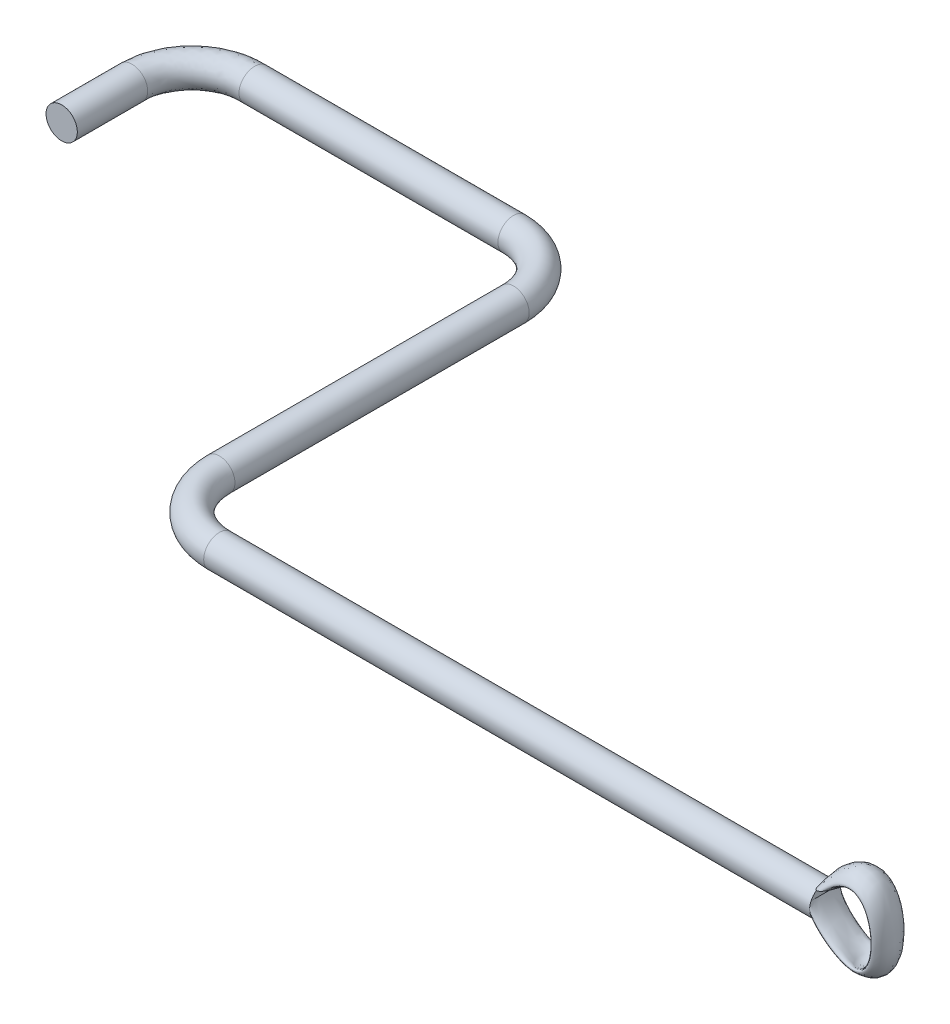
ISO-10303-21;
HEADER;
FILE_DESCRIPTION(('STEP AP214'),'2;1');
FILE_NAME('part.step','',(''),(''),'','','');
FILE_SCHEMA(('AUTOMOTIVE_DESIGN { 1 0 10303 214 1 1 1 1 }'));
ENDSEC;
DATA;
#1=APPLICATION_CONTEXT('core data for automotive mechanical design processes');
#2=APPLICATION_PROTOCOL_DEFINITION('international standard','automotive_design',2000,#1);
#3=PRODUCT_CONTEXT('',#1,'mechanical');
#4=PRODUCT('Part','Part','',(#3));
#5=PRODUCT_RELATED_PRODUCT_CATEGORY('part','',(#4));
#6=PRODUCT_DEFINITION_FORMATION('','',#4);
#7=PRODUCT_DEFINITION_CONTEXT('part definition',#1,'design');
#8=PRODUCT_DEFINITION('design','',#6,#7);
#9=PRODUCT_DEFINITION_SHAPE('','',#8);
#10=(LENGTH_UNIT() NAMED_UNIT(*) SI_UNIT(.MILLI.,.METRE.));
#11=(NAMED_UNIT(*) PLANE_ANGLE_UNIT() SI_UNIT($,.RADIAN.));
#12=(NAMED_UNIT(*) SI_UNIT($,.STERADIAN.) SOLID_ANGLE_UNIT());
#13=UNCERTAINTY_MEASURE_WITH_UNIT(LENGTH_MEASURE(1.E-05),#10,'distance_accuracy_value','');
#14=(GEOMETRIC_REPRESENTATION_CONTEXT(3) GLOBAL_UNCERTAINTY_ASSIGNED_CONTEXT((#13)) GLOBAL_UNIT_ASSIGNED_CONTEXT((#10,
#11,#12)) REPRESENTATION_CONTEXT('',''));
#15=CARTESIAN_POINT('',(0.,0.,0.));
#16=DIRECTION('',(0.,0.,1.));
#17=DIRECTION('',(1.,0.,0.));
#18=AXIS2_PLACEMENT_3D('',#15,#16,#17);
#19=CARTESIAN_POINT('',(-28.0867327548862,0.,-14.8763253538533));
#20=DIRECTION('',(1.,0.,0.));
#21=DIRECTION('',(0.,0.,-1.));
#22=AXIS2_PLACEMENT_3D('',#19,#20,#21);
#23=PLANE('',#22);
#24=CARTESIAN_POINT('',(-28.0867327548862,0.,-14.8763253538533));
#25=DIRECTION('',(1.,0.,0.));
#26=DIRECTION('',(0.,0.,-1.));
#27=AXIS2_PLACEMENT_3D('',#24,#25,#26);
#28=CIRCLE('',#27,1.5);
#29=CARTESIAN_POINT('',(-28.0867327548862,0.66725188973408,-16.2138998346889));
#30=VERTEX_POINT('',#29);
#31=CARTESIAN_POINT('',(-28.0867327548862,0.667190066581111,-13.5390715850401));
#32=VERTEX_POINT('',#31);
#33=EDGE_CURVE('E50',#30,#32,#28,.T.);
#34=ORIENTED_EDGE('',*,*,#33,.T.);
#35=CARTESIAN_POINT('',(-28.0867327548862,0.662897590662795,-16.204779537628));
#36=CARTESIAN_POINT('',(-28.0867327548859,0.662373655609823,-16.2024232680016));
#37=CARTESIAN_POINT('',(-28.0867327548858,0.661861788854896,-16.2000643351667));
#38=CARTESIAN_POINT('',(-28.0867327548846,0.657691507317004,-16.1803806935537));
#39=CARTESIAN_POINT('',(-28.0867327548857,0.654643909870637,-16.162925273578));
#40=CARTESIAN_POINT('',(-28.0867327548866,0.649395506396306,-16.1278857030632));
#41=CARTESIAN_POINT('',(-28.0867327548863,0.647195226447549,-16.1103014794339));
#42=CARTESIAN_POINT('',(-28.0867327548859,0.641471875485622,-16.057370233921));
#43=CARTESIAN_POINT('',(-28.0867327548861,0.638841175113105,-16.0219289173038));
#44=CARTESIAN_POINT('',(-28.0867327548862,0.634837098240325,-15.9509355237771));
#45=CARTESIAN_POINT('',(-28.0867327548862,0.633465703658227,-15.9153833603338));
#46=CARTESIAN_POINT('',(-28.0867327548861,0.63144874348452,-15.8440249735028));
#47=CARTESIAN_POINT('',(-28.0867327548861,0.630808010348437,-15.8082186168554));
#48=CARTESIAN_POINT('',(-28.0867327548862,0.629953066052022,-15.7366719912004));
#49=CARTESIAN_POINT('',(-28.0867327548864,0.629738027587962,-15.7009317291334));
#50=CARTESIAN_POINT('',(-28.086732754886,0.629549553101969,-15.629475085263));
#51=CARTESIAN_POINT('',(-28.0867327548854,0.629575952454032,-15.5937587037921));
#52=CARTESIAN_POINT('',(-28.0867327548847,0.629843538213155,-15.4817211714316));
#53=CARTESIAN_POINT('',(-28.0867327548858,0.630294791709847,-15.4054008289412));
#54=CARTESIAN_POINT('',(-28.0867327548865,0.631151077054613,-15.2527070467432));
#55=CARTESIAN_POINT('',(-28.0867327548863,0.631556076601742,-15.1763336069512));
#56=CARTESIAN_POINT('',(-28.0867327548861,0.632109942559785,-15.0235602445307));
#57=CARTESIAN_POINT('',(-28.0867327548861,0.632258723904588,-14.9471603215267));
#58=CARTESIAN_POINT('',(-28.0867327548862,0.632243962390603,-14.7943600328904));
#59=CARTESIAN_POINT('',(-28.0867327548862,0.632080417596263,-14.7179596672583));
#60=CARTESIAN_POINT('',(-28.0867327548862,0.631503143840482,-14.565185470391));
#61=CARTESIAN_POINT('',(-28.0867327548862,0.631089497968975,-14.4888116387685));
#62=CARTESIAN_POINT('',(-28.0867327548861,0.630232447118724,-14.3361163213644));
#63=CARTESIAN_POINT('',(-28.0867327548861,0.629789062744159,-14.2597948356058));
#64=CARTESIAN_POINT('',(-28.0867327548861,0.629566031434188,-14.1483765494744));
#65=CARTESIAN_POINT('',(-28.0867327548861,0.629557226749275,-14.1132805474324));
#66=CARTESIAN_POINT('',(-28.0867327548862,0.629785203470881,-14.0430655513341));
#67=CARTESIAN_POINT('',(-28.0867327548862,0.630022150230032,-14.0079465577071));
#68=CARTESIAN_POINT('',(-28.0867327548862,0.630922603191843,-13.9376451814509));
#69=CARTESIAN_POINT('',(-28.0867327548861,0.631586926494628,-13.9024628064063));
#70=CARTESIAN_POINT('',(-28.0867327548862,0.63364665295898,-13.8323475017529));
#71=CARTESIAN_POINT('',(-28.0867327548862,0.635037282424472,-13.7974144354105));
#72=CARTESIAN_POINT('',(-28.0867327548861,0.639062152017563,-13.7276583152487));
#73=CARTESIAN_POINT('',(-28.0867327548861,0.641694472218967,-13.6928351748546));
#74=CARTESIAN_POINT('',(-28.0867327548862,0.647381782338597,-13.6408280894011));
#75=CARTESIAN_POINT('',(-28.0867327548863,0.649563742869341,-13.6235506907368));
#76=CARTESIAN_POINT('',(-28.086732754886,0.654749007987336,-13.5891213997286));
#77=CARTESIAN_POINT('',(-28.0867327548856,0.657751813381786,-13.5719694375895));
#78=CARTESIAN_POINT('',(-28.0867327548862,0.661862316375775,-13.552586092982));
#79=CARTESIAN_POINT('',(-28.0867327548863,0.662374743896722,-13.5502272846936));
#80=CARTESIAN_POINT('',(-28.0867327548864,0.662899374402507,-13.547871170076));
#81=B_SPLINE_CURVE_WITH_KNOTS('',3,(#35,#36,#37,#38,#39,#40,#41,#42,#43,#44,#45,#46,#47,#48,#49,
#50,#51,#52,#53,#54,#55,#56,#57,#58,#59,#60,#61,#62,#63,#64,#65,#66,#67,#68,#69,#70,#71,#72,#73,
#74,#75,#76,#77,#78,#79,#80),.UNSPECIFIED.,.F.,.F.,(4,2,2,2,2,2,2,2,2,2,2,2,2,2,2,2,2,2,2,2,2,2,
4),(0.,0.00724141043704764,0.0603611622285066,0.113513841835515,0.220075324803818,
0.326804230149168,0.434234999095671,0.541456779119819,0.648605454703506,0.877570038730344,
1.10669355243074,1.33589312197412,1.56509411192115,1.7942189972832,2.02318674248067,
2.12847422168256,2.23383258902594,2.33939299183055,2.44426816399734,2.54898170504612,
2.60121471090506,2.65341602191442,2.66065742354629),.UNSPECIFIED.);
#82=EDGE_CURVE('E86',#30,#32,#81,.T.);
#83=ORIENTED_EDGE('',*,*,#82,.F.);
#84=EDGE_LOOP('',(#34,#83));
#85=FACE_BOUND('',#84,.T.);
#86=ADVANCED_FACE('F33',(#85),#23,.T.);
#87=CARTESIAN_POINT('',(-129.28449648949,0.,-42.8339767538688));
#88=DIRECTION('',(0.,0.,-1.));
#89=DIRECTION('',(-1.,0.,0.));
#90=AXIS2_PLACEMENT_3D('',#87,#88,#89);
#91=PLANE('',#90);
#92=CARTESIAN_POINT('',(-129.28449648949,0.,-42.8339767538688));
#93=DIRECTION('',(0.,0.,-1.));
#94=DIRECTION('',(-1.,0.,0.));
#95=AXIS2_PLACEMENT_3D('',#92,#93,#94);
#96=CIRCLE('',#95,1.5);
#97=CARTESIAN_POINT('',(-130.78449648949,0.,-42.8339767538688));
#98=VERTEX_POINT('',#97);
#99=EDGE_CURVE('E126',#98,#98,#96,.T.);
#100=ORIENTED_EDGE('',*,*,#99,.F.);
#101=EDGE_LOOP('',(#100));
#102=FACE_BOUND('',#101,.T.);
#103=ADVANCED_FACE('F199',(#102),#91,.F.);
#104=CARTESIAN_POINT('',(-98.4278171552191,0.,-49.4561485789191));
#105=DIRECTION('',(0.,-1.,0.));
#106=DIRECTION('',(0.,0.,-1.));
#107=AXIS2_PLACEMENT_3D('',#104,#105,#106);
#108=TOROIDAL_SURFACE('',#107,5.8636289646401,1.5);
#109=CARTESIAN_POINT('',(-98.4278171552191,0.,-55.3197775435592));
#110=DIRECTION('',(1.,0.,0.));
#111=DIRECTION('',(0.,0.,-1.));
#112=AXIS2_PLACEMENT_3D('',#109,#110,#111);
#113=CIRCLE('',#112,1.5);
#114=CARTESIAN_POINT('',(-98.4278171552191,0.,-56.8197775435592));
#115=VERTEX_POINT('',#114);
#116=EDGE_CURVE('E290',#115,#115,#113,.T.);
#117=CARTESIAN_POINT('',(-92.564188190579,0.,-49.4561485789191));
#118=DIRECTION('',(0.,0.,1.));
#119=DIRECTION('',(1.,0.,0.));
#120=AXIS2_PLACEMENT_3D('',#117,#118,#119);
#121=CIRCLE('',#120,1.5);
#122=CARTESIAN_POINT('',(-91.064188190579,0.,-49.4561485789191));
#123=VERTEX_POINT('',#122);
#124=EDGE_CURVE('E289',#123,#123,#121,.T.);
#125=CARTESIAN_POINT('',(-98.4278171552191,0.,-49.4561485789191));
#126=DIRECTION('',(0.,-1.,0.));
#127=DIRECTION('',(0.,0.,-1.));
#128=AXIS2_PLACEMENT_3D('',#125,#126,#127);
#129=CIRCLE('',#128,7.3636289646401);
#130=EDGE_CURVE('',#115,#123,#129,.T.);
#131=ORIENTED_EDGE('',*,*,#116,.T.);
#132=ORIENTED_EDGE('',*,*,#124,.F.);
#133=ORIENTED_EDGE('',*,*,#130,.T.);
#134=ORIENTED_EDGE('',*,*,#130,.F.);
#135=EDGE_LOOP('',(#131,#133,#132,#134));
#136=FACE_BOUND('',#135,.T.);
#137=ADVANCED_FACE('F163',(#136),#108,.T.);
#138=CARTESIAN_POINT('',(-92.564188190579,0.,-49.4561485789191));
#139=DIRECTION('',(0.,0.,1.));
#140=DIRECTION('',(1.,0.,0.));
#141=AXIS2_PLACEMENT_3D('',#138,#139,#140);
#142=CYLINDRICAL_SURFACE('',#141,1.5);
#143=CARTESIAN_POINT('',(-92.564188190579,0.,-21.2352715982895));
#144=DIRECTION('',(0.,0.,1.));
#145=DIRECTION('',(1.,0.,0.));
#146=AXIS2_PLACEMENT_3D('',#143,#144,#145);
#147=CIRCLE('',#146,1.5);
#148=CARTESIAN_POINT('',(-94.064188190579,0.,-21.2352715982895));
#149=VERTEX_POINT('',#148);
#150=EDGE_CURVE('E286',#149,#149,#147,.T.);
#151=ORIENTED_EDGE('',*,*,#150,.F.);
#152=EDGE_LOOP('',(#151));
#153=FACE_BOUND('',#152,.T.);
#154=ORIENTED_EDGE('',*,*,#124,.T.);
#155=EDGE_LOOP('',(#154));
#156=FACE_BOUND('',#155,.T.);
#157=ADVANCED_FACE('F207',(#153,#156),#142,.T.);
#158=CARTESIAN_POINT('',(-86.2052419461428,0.,-21.2352715982895));
#159=DIRECTION('',(0.,1.,0.));
#160=DIRECTION('',(0.,0.,1.));
#161=AXIS2_PLACEMENT_3D('',#158,#159,#160);
#162=TOROIDAL_SURFACE('',#161,6.35894624443623,1.5);
#163=CARTESIAN_POINT('',(-86.2052419461428,0.,-14.8763253538533));
#164=DIRECTION('',(1.,0.,0.));
#165=DIRECTION('',(0.,0.,-1.));
#166=AXIS2_PLACEMENT_3D('',#163,#164,#165);
#167=CIRCLE('',#166,1.5);
#168=CARTESIAN_POINT('',(-86.2052419461428,0.,-13.3763253538533));
#169=VERTEX_POINT('',#168);
#170=EDGE_CURVE('E178',#169,#169,#167,.T.);
#171=CARTESIAN_POINT('',(-86.2052419461428,0.,-21.2352715982895));
#172=DIRECTION('',(0.,1.,0.));
#173=DIRECTION('',(0.,0.,1.));
#174=AXIS2_PLACEMENT_3D('',#171,#172,#173);
#175=CIRCLE('',#174,7.85894624443622);
#176=EDGE_CURVE('',#149,#169,#175,.T.);
#177=ORIENTED_EDGE('',*,*,#150,.T.);
#178=ORIENTED_EDGE('',*,*,#170,.F.);
#179=ORIENTED_EDGE('',*,*,#176,.T.);
#180=ORIENTED_EDGE('',*,*,#176,.F.);
#181=EDGE_LOOP('',(#177,#179,#178,#180));
#182=FACE_BOUND('',#181,.T.);
#183=ADVANCED_FACE('F198',(#182),#162,.T.);
#184=CARTESIAN_POINT('',(-86.2052419461428,0.,-14.8763253538533));
#185=DIRECTION('',(1.,0.,0.));
#186=DIRECTION('',(0.,0.,-1.));
#187=AXIS2_PLACEMENT_3D('',#184,#185,#186);
#188=CYLINDRICAL_SURFACE('',#187,1.5);
#189=CARTESIAN_POINT('',(-28.0867327548862,0.,-16.3763253538533));
#190=VERTEX_POINT('',#189);
#191=EDGE_CURVE('E56',#190,#30,#28,.T.);
#192=ORIENTED_EDGE('',*,*,#191,.F.);
#193=EDGE_CURVE('E37',#32,#190,#28,.T.);
#194=ORIENTED_EDGE('',*,*,#193,.F.);
#195=ORIENTED_EDGE('',*,*,#33,.F.);
#196=EDGE_LOOP('',(#192,#194,#195));
#197=FACE_BOUND('',#196,.T.);
#198=ORIENTED_EDGE('',*,*,#170,.T.);
#199=EDGE_LOOP('',(#198));
#200=FACE_BOUND('',#199,.T.);
#201=ADVANCED_FACE('F161',(#197,#200),#188,.T.);
#202=CARTESIAN_POINT('',(-123.627817155219,0.,-55.3197775435592));
#203=DIRECTION('',(1.,0.,0.));
#204=DIRECTION('',(0.,0.,-1.));
#205=AXIS2_PLACEMENT_3D('',#202,#203,#204);
#206=CYLINDRICAL_SURFACE('',#205,1.5);
#207=ORIENTED_EDGE('',*,*,#116,.F.);
#208=EDGE_LOOP('',(#207));
#209=FACE_BOUND('',#208,.T.);
#210=CARTESIAN_POINT('',(-123.227859144867,0.,-55.3156794835219));
#211=DIRECTION('',(0.99979005176,0.,0.0204903001865974));
#212=DIRECTION('',(0.0204903001865974,0.,-0.99979005176));
#213=AXIS2_PLACEMENT_3D('',#210,#211,#212);
#214=CIRCLE('',#213,1.5);
#215=CARTESIAN_POINT('',(-123.197123694587,0.,-56.8175710523606));
#216=VERTEX_POINT('',#215);
#217=EDGE_CURVE('E11',#216,#216,#214,.T.);
#218=ORIENTED_EDGE('',*,*,#217,.T.);
#219=EDGE_LOOP('',(#218));
#220=FACE_BOUND('',#219,.T.);
#221=ADVANCED_FACE('F152',(#209,#220),#206,.T.);
#222=CARTESIAN_POINT('',(-129.28449648949,0.,-42.8339767538688));
#223=DIRECTION('',(0.,0.,-1.));
#224=DIRECTION('',(-1.,0.,0.));
#225=AXIS2_PLACEMENT_3D('',#222,#223,#224);
#226=CYLINDRICAL_SURFACE('',#225,1.5);
#227=CARTESIAN_POINT('',(-129.28449648949,0.,-49.5818986693735));
#228=DIRECTION('',(0.,0.,-1.));
#229=DIRECTION('',(-1.,0.,0.));
#230=AXIS2_PLACEMENT_3D('',#227,#228,#229);
#231=CIRCLE('',#230,1.5);
#232=CARTESIAN_POINT('',(-130.78449648949,0.,-49.5818986693735));
#233=VERTEX_POINT('',#232);
#234=EDGE_CURVE('E43',#233,#233,#231,.T.);
#235=ORIENTED_EDGE('',*,*,#234,.F.);
#236=EDGE_LOOP('',(#235));
#237=FACE_BOUND('',#236,.T.);
#238=ORIENTED_EDGE('',*,*,#99,.T.);
#239=EDGE_LOOP('',(#238));
#240=FACE_BOUND('',#239,.T.);
#241=ADVANCED_FACE('F151',(#237,#240),#226,.T.);
#242=CARTESIAN_POINT('',(-130.78449648949,0.,-49.5818986693735));
#243=CARTESIAN_POINT('',(-130.78449648949,0.,-49.6894611855601));
#244=CARTESIAN_POINT('',(-130.781512856763,0.,-49.8218397771141));
#245=CARTESIAN_POINT('',(-130.769593843221,0.,-50.0614026047151));
#246=CARTESIAN_POINT('',(-130.760658308925,0.,-50.1810187186135));
#247=CARTESIAN_POINT('',(-130.724954956472,0.,-50.5389915467595));
#248=CARTESIAN_POINT('',(-130.689283387978,0.,-50.7764789646534));
#249=CARTESIAN_POINT('',(-130.547104084981,0.,-51.4821505918036));
#250=CARTESIAN_POINT('',(-130.405276919963,0.,-51.9435414451102));
#251=CARTESIAN_POINT('',(-129.846969362046,0.,-53.2721230761985));
#252=CARTESIAN_POINT('',(-129.297212640006,0.,-54.0810811867195));
#253=CARTESIAN_POINT('',(-127.925794519439,0.,-55.4246806247842));
#254=CARTESIAN_POINT('',(-127.106760587669,0.,-55.9570619088186));
#255=CARTESIAN_POINT('',(-125.768227304001,0.,-56.4879700603153));
#256=CARTESIAN_POINT('',(-125.304308192885,0.,-56.6204458968474));
#257=CARTESIAN_POINT('',(-124.595573287463,0.,-56.7484270049721));
#258=CARTESIAN_POINT('',(-124.357185342504,0.,-56.7793330541502));
#259=CARTESIAN_POINT('',(-123.997992995695,0.,-56.8078194235854));
#260=CARTESIAN_POINT('',(-123.87799239089,0.,-56.8143375740007));
#261=CARTESIAN_POINT('',(-123.637698633798,0.,-56.8213920952321));
#262=CARTESIAN_POINT('',(-123.504939409815,0.,-56.821667878446));
#263=CARTESIAN_POINT('',(-123.321718710404,0.,-56.8179217503822));
#264=CARTESIAN_POINT('',(-123.263776364703,0.,-56.8167305811734));
#265=CARTESIAN_POINT('',(-123.197123694587,0.,-56.8153645611619));
#266=CARTESIAN_POINT('',(-130.78449648949,2.99999999999999,-49.5818986693735));
#267=CARTESIAN_POINT('',(-130.78449648949,2.99999999999999,-49.6894611855601));
#268=CARTESIAN_POINT('',(-130.781512856763,2.99999999999999,-49.8218397771142));
#269=CARTESIAN_POINT('',(-130.769593843221,2.99999999999999,-50.0614026047151));
#270=CARTESIAN_POINT('',(-130.760658308925,2.99999999999999,-50.1810187186135));
#271=CARTESIAN_POINT('',(-130.724954956472,2.99999999999999,-50.5389915467595));
#272=CARTESIAN_POINT('',(-130.689283387978,2.99999999999999,-50.7764789646534));
#273=CARTESIAN_POINT('',(-130.547104084981,2.99999999999999,-51.4821505918036));
#274=CARTESIAN_POINT('',(-130.405276919963,2.99999999999999,-51.9435414451103));
#275=CARTESIAN_POINT('',(-129.846969362046,2.99999999999999,-53.2721230761985));
#276=CARTESIAN_POINT('',(-129.297212640006,2.99999999999999,-54.0810811867195));
#277=CARTESIAN_POINT('',(-127.925794519439,2.99999999999999,-55.4246806247842));
#278=CARTESIAN_POINT('',(-127.106760587669,2.99999999999999,-55.9570619088186));
#279=CARTESIAN_POINT('',(-125.768227304001,2.99999999999999,-56.4879700603153));
#280=CARTESIAN_POINT('',(-125.304308192885,2.99999999999999,-56.6204458968474));
#281=CARTESIAN_POINT('',(-124.595573287463,2.99999999999999,-56.7484270049721));
#282=CARTESIAN_POINT('',(-124.357185342504,2.99999999999999,-56.7793330541502));
#283=CARTESIAN_POINT('',(-123.997992995695,2.99999999999999,-56.8078194235854));
#284=CARTESIAN_POINT('',(-123.87799239089,2.99999999999999,-56.8143375740007));
#285=CARTESIAN_POINT('',(-123.637698633798,2.99999999999999,-56.8213920952321));
#286=CARTESIAN_POINT('',(-123.504939409815,2.99999999999999,-56.821667878446));
#287=CARTESIAN_POINT('',(-123.321718710404,2.99999999999999,-56.8179217503822));
#288=CARTESIAN_POINT('',(-123.263776364703,2.99999999999999,-56.8167305811734));
#289=CARTESIAN_POINT('',(-123.197123694587,2.99999999999999,-56.8153645611619));
#290=CARTESIAN_POINT('',(-127.78449648949,2.99999999999999,-49.5818986693735));
#291=CARTESIAN_POINT('',(-127.78449648949,2.99999999999999,-49.6645973096059));
#292=CARTESIAN_POINT('',(-127.78274932514,2.99999999999999,-49.7224040826775));
#293=CARTESIAN_POINT('',(-127.775769754446,2.99999999999999,-49.8626879815934));
#294=CARTESIAN_POINT('',(-127.770537258226,2.99999999999999,-49.9327331342535));
#295=CARTESIAN_POINT('',(-127.749629985021,2.99999999999999,-50.1423559064574));
#296=CARTESIAN_POINT('',(-127.728741323959,2.99999999999999,-50.2814244809069));
#297=CARTESIAN_POINT('',(-127.645483553253,2.99999999999999,-50.6946537293817));
#298=CARTESIAN_POINT('',(-127.562431988537,2.99999999999999,-50.9648363302235));
#299=CARTESIAN_POINT('',(-127.235496621285,2.99999999999999,-51.7428310345943));
#300=CARTESIAN_POINT('',(-126.913568477453,2.99999999999999,-52.2165430830829));
#301=CARTESIAN_POINT('',(-126.110489456693,2.99999999999999,-53.0033319586428));
#302=CARTESIAN_POINT('',(-125.630877179428,2.99999999999999,-53.3150853428491));
#303=CARTESIAN_POINT('',(-124.847054957333,2.99999999999999,-53.6259760858097));
#304=CARTESIAN_POINT('',(-124.575391851913,2.99999999999999,-53.7035516723348));
#305=CARTESIAN_POINT('',(-124.160368800018,2.99999999999999,-53.7784952226993));
#306=CARTESIAN_POINT('',(-124.020772892305,2.99999999999999,-53.7965932770681));
#307=CARTESIAN_POINT('',(-123.810435990808,2.99999999999999,-53.8132744083204));
#308=CARTESIAN_POINT('',(-123.740165686842,2.99999999999999,-53.8170913258411));
#309=CARTESIAN_POINT('',(-123.599453768103,2.99999999999999,-53.8212223329479));
#310=CARTESIAN_POINT('',(-123.541478209456,2.99999999999999,-53.8217889226909));
#311=CARTESIAN_POINT('',(-123.400610320846,2.99999999999999,-53.8189071072788));
#312=CARTESIAN_POINT('',(-123.325247265264,2.99999999999999,-53.8173604258934));
#313=CARTESIAN_POINT('',(-123.258594595147,2.99999999999999,-53.8159944058819));
#314=CARTESIAN_POINT('',(-127.78449648949,0.,-49.5818986693735));
#315=CARTESIAN_POINT('',(-127.78449648949,0.,-49.6645973096059));
#316=CARTESIAN_POINT('',(-127.78274932514,0.,-49.7224040826775));
#317=CARTESIAN_POINT('',(-127.775769754446,0.,-49.8626879815934));
#318=CARTESIAN_POINT('',(-127.770537258226,0.,-49.9327331342534));
#319=CARTESIAN_POINT('',(-127.749629985021,0.,-50.1423559064574));
#320=CARTESIAN_POINT('',(-127.728741323959,0.,-50.2814244809069));
#321=CARTESIAN_POINT('',(-127.645483553253,0.,-50.6946537293817));
#322=CARTESIAN_POINT('',(-127.562431988537,0.,-50.9648363302235));
#323=CARTESIAN_POINT('',(-127.235496621285,0.,-51.7428310345943));
#324=CARTESIAN_POINT('',(-126.913568477453,0.,-52.2165430830829));
#325=CARTESIAN_POINT('',(-126.110489456693,0.,-53.0033319586428));
#326=CARTESIAN_POINT('',(-125.630877179428,0.,-53.3150853428491));
#327=CARTESIAN_POINT('',(-124.847054957333,0.,-53.6259760858097));
#328=CARTESIAN_POINT('',(-124.575391851913,0.,-53.7035516723348));
#329=CARTESIAN_POINT('',(-124.160368800018,0.,-53.7784952226993));
#330=CARTESIAN_POINT('',(-124.020772892305,0.,-53.7965932770681));
#331=CARTESIAN_POINT('',(-123.810435990808,0.,-53.8132744083204));
#332=CARTESIAN_POINT('',(-123.740165686842,0.,-53.817091325841));
#333=CARTESIAN_POINT('',(-123.599453768103,0.,-53.8212223329479));
#334=CARTESIAN_POINT('',(-123.541478209456,0.,-53.8217889226908));
#335=CARTESIAN_POINT('',(-123.400610320846,0.,-53.8189071072788));
#336=CARTESIAN_POINT('',(-123.325247265264,0.,-53.8173604258934));
#337=CARTESIAN_POINT('',(-123.258594595147,0.,-53.8159944058819));
#338=CARTESIAN_POINT('',(-127.78449648949,-2.99999999999999,-49.5818986693735));
#339=CARTESIAN_POINT('',(-127.78449648949,-2.99999999999999,-49.6645973096059));
#340=CARTESIAN_POINT('',(-127.78274932514,-2.99999999999999,-49.7224040826775));
#341=CARTESIAN_POINT('',(-127.775769754446,-2.99999999999999,-49.8626879815934));
#342=CARTESIAN_POINT('',(-127.770537258226,-2.99999999999999,-49.9327331342535));
#343=CARTESIAN_POINT('',(-127.749629985021,-2.99999999999999,-50.1423559064574));
#344=CARTESIAN_POINT('',(-127.728741323959,-2.99999999999999,-50.2814244809069));
#345=CARTESIAN_POINT('',(-127.645483553253,-2.99999999999999,-50.6946537293817));
#346=CARTESIAN_POINT('',(-127.562431988537,-2.99999999999999,-50.9648363302235));
#347=CARTESIAN_POINT('',(-127.235496621285,-2.99999999999999,-51.7428310345943));
#348=CARTESIAN_POINT('',(-126.913568477453,-2.99999999999999,-52.2165430830829));
#349=CARTESIAN_POINT('',(-126.110489456693,-2.99999999999999,-53.0033319586428));
#350=CARTESIAN_POINT('',(-125.630877179428,-2.99999999999999,-53.3150853428491));
#351=CARTESIAN_POINT('',(-124.847054957333,-2.99999999999999,-53.6259760858097));
#352=CARTESIAN_POINT('',(-124.575391851913,-2.99999999999999,-53.7035516723348));
#353=CARTESIAN_POINT('',(-124.160368800018,-2.99999999999999,-53.7784952226993));
#354=CARTESIAN_POINT('',(-124.020772892305,-2.99999999999999,-53.7965932770681));
#355=CARTESIAN_POINT('',(-123.810435990808,-2.99999999999999,-53.8132744083204));
#356=CARTESIAN_POINT('',(-123.740165686842,-2.99999999999999,-53.8170913258411));
#357=CARTESIAN_POINT('',(-123.599453768103,-2.99999999999999,-53.8212223329479));
#358=CARTESIAN_POINT('',(-123.541478209456,-2.99999999999999,-53.8217889226909));
#359=CARTESIAN_POINT('',(-123.400610320846,-2.99999999999999,-53.8189071072788));
#360=CARTESIAN_POINT('',(-123.325247265264,-2.99999999999999,-53.8173604258934));
#361=CARTESIAN_POINT('',(-123.258594595147,-2.99999999999999,-53.8159944058819));
#362=CARTESIAN_POINT('',(-130.78449648949,-2.99999999999999,-49.5818986693735));
#363=CARTESIAN_POINT('',(-130.78449648949,-2.99999999999999,-49.6894611855601));
#364=CARTESIAN_POINT('',(-130.781512856763,-2.99999999999999,-49.8218397771142));
#365=CARTESIAN_POINT('',(-130.769593843221,-2.99999999999999,-50.0614026047151));
#366=CARTESIAN_POINT('',(-130.760658308925,-2.99999999999999,-50.1810187186135));
#367=CARTESIAN_POINT('',(-130.724954956472,-2.99999999999999,-50.5389915467595));
#368=CARTESIAN_POINT('',(-130.689283387978,-2.99999999999999,-50.7764789646534));
#369=CARTESIAN_POINT('',(-130.547104084981,-2.99999999999999,-51.4821505918036));
#370=CARTESIAN_POINT('',(-130.405276919963,-2.99999999999999,-51.9435414451103));
#371=CARTESIAN_POINT('',(-129.846969362046,-2.99999999999999,-53.2721230761985));
#372=CARTESIAN_POINT('',(-129.297212640006,-2.99999999999999,-54.0810811867195));
#373=CARTESIAN_POINT('',(-127.925794519439,-2.99999999999999,-55.4246806247842));
#374=CARTESIAN_POINT('',(-127.106760587669,-2.99999999999999,-55.9570619088186));
#375=CARTESIAN_POINT('',(-125.768227304001,-2.99999999999999,-56.4879700603153));
#376=CARTESIAN_POINT('',(-125.304308192885,-2.99999999999999,-56.6204458968474));
#377=CARTESIAN_POINT('',(-124.595573287463,-2.99999999999999,-56.7484270049721));
#378=CARTESIAN_POINT('',(-124.357185342504,-2.99999999999999,-56.7793330541502));
#379=CARTESIAN_POINT('',(-123.997992995695,-2.99999999999999,-56.8078194235854));
#380=CARTESIAN_POINT('',(-123.87799239089,-2.99999999999999,-56.8143375740007));
#381=CARTESIAN_POINT('',(-123.637698633798,-2.99999999999999,-56.8213920952321));
#382=CARTESIAN_POINT('',(-123.504939409815,-2.99999999999999,-56.821667878446));
#383=CARTESIAN_POINT('',(-123.321718710404,-2.99999999999999,-56.8179217503822));
#384=CARTESIAN_POINT('',(-123.263776364703,-2.99999999999999,-56.8167305811734));
#385=CARTESIAN_POINT('',(-123.197123694587,-2.99999999999999,-56.8153645611619));
#386=CARTESIAN_POINT('',(-130.78449648949,0.,-49.5818986693735));
#387=CARTESIAN_POINT('',(-130.78449648949,0.,-49.6894611855601));
#388=CARTESIAN_POINT('',(-130.781512856763,0.,-49.8218397771141));
#389=CARTESIAN_POINT('',(-130.769593843221,0.,-50.0614026047151));
#390=CARTESIAN_POINT('',(-130.760658308925,0.,-50.1810187186135));
#391=CARTESIAN_POINT('',(-130.724954956472,0.,-50.5389915467595));
#392=CARTESIAN_POINT('',(-130.689283387978,0.,-50.7764789646534));
#393=CARTESIAN_POINT('',(-130.547104084981,0.,-51.4821505918036));
#394=CARTESIAN_POINT('',(-130.405276919963,0.,-51.9435414451102));
#395=CARTESIAN_POINT('',(-129.846969362046,0.,-53.2721230761985));
#396=CARTESIAN_POINT('',(-129.297212640006,0.,-54.0810811867195));
#397=CARTESIAN_POINT('',(-127.925794519439,0.,-55.4246806247842));
#398=CARTESIAN_POINT('',(-127.106760587669,0.,-55.9570619088186));
#399=CARTESIAN_POINT('',(-125.768227304001,0.,-56.4879700603153));
#400=CARTESIAN_POINT('',(-125.304308192885,0.,-56.6204458968474));
#401=CARTESIAN_POINT('',(-124.595573287463,0.,-56.7484270049721));
#402=CARTESIAN_POINT('',(-124.357185342504,0.,-56.7793330541502));
#403=CARTESIAN_POINT('',(-123.997992995695,0.,-56.8078194235854));
#404=CARTESIAN_POINT('',(-123.87799239089,0.,-56.8143375740007));
#405=CARTESIAN_POINT('',(-123.637698633798,0.,-56.8213920952321));
#406=CARTESIAN_POINT('',(-123.504939409815,0.,-56.821667878446));
#407=CARTESIAN_POINT('',(-123.321718710404,0.,-56.8179217503822));
#408=CARTESIAN_POINT('',(-123.263776364703,0.,-56.8167305811734));
#409=CARTESIAN_POINT('',(-123.197123694587,0.,-56.8153645611619));
#410=(BOUNDED_SURFACE() B_SPLINE_SURFACE(3,3,((#242,#243,#244,#245,#246,#247,#248,#249,#250,
#251,#252,#253,#254,#255,#256,#257,#258,#259,#260,#261,#262,#263,#264,#265),(#266,#267,#268,
#269,#270,#271,#272,#273,#274,#275,#276,#277,#278,#279,#280,#281,#282,#283,#284,#285,#286,#287,
#288,#289),(#290,#291,#292,#293,#294,#295,#296,#297,#298,#299,#300,#301,#302,#303,#304,#305,
#306,#307,#308,#309,#310,#311,#312,#313),(#314,#315,#316,#317,#318,#319,#320,#321,#322,#323,
#324,#325,#326,#327,#328,#329,#330,#331,#332,#333,#334,#335,#336,#337),(#338,#339,#340,#341,
#342,#343,#344,#345,#346,#347,#348,#349,#350,#351,#352,#353,#354,#355,#356,#357,#358,#359,#360,
#361),(#362,#363,#364,#365,#366,#367,#368,#369,#370,#371,#372,#373,#374,#375,#376,#377,#378,
#379,#380,#381,#382,#383,#384,#385),(#386,#387,#388,#389,#390,#391,#392,#393,#394,#395,#396,
#397,#398,#399,#400,#401,#402,#403,#404,#405,#406,#407,#408,#409)),.UNSPECIFIED.,.T.,.F.,
.F.) B_SPLINE_SURFACE_WITH_KNOTS((4,3,4),(4,2,2,2,2,2,2,2,2,2,2,4),(0.,0.5,1.),
(0.424919870725509,0.442891124765337,0.460862378805165,0.496804886884821,0.568689903044132,
0.712459935362755,0.856229967681377,0.928114983840689,0.964057491920344,0.982028745960172,1.,
1.01255698442276),.UNSPECIFIED.) GEOMETRIC_REPRESENTATION_ITEM() RATIONAL_B_SPLINE_SURFACE(((1.,
1.,1.,1.,1.,1.,1.,1.,1.,1.,1.,1.,1.,1.,1.,1.,1.,1.,1.,1.,1.,1.,1.,1.),(0.333333333333333,
0.333333333333333,0.333333333333333,0.333333333333333,0.333333333333333,0.333333333333333,
0.333333333333333,0.333333333333333,0.333333333333333,0.333333333333333,0.333333333333333,
0.333333333333333,0.333333333333333,0.333333333333333,0.333333333333333,0.333333333333333,
0.333333333333333,0.333333333333333,0.333333333333333,0.333333333333333,0.333333333333333,
0.333333333333333,0.333333333333333,0.333333333333333),(0.333333333333333,0.333333333333333,
0.333333333333333,0.333333333333333,0.333333333333333,0.333333333333333,0.333333333333333,
0.333333333333333,0.333333333333333,0.333333333333333,0.333333333333333,0.333333333333333,
0.333333333333333,0.333333333333333,0.333333333333333,0.333333333333333,0.333333333333333,
0.333333333333333,0.333333333333333,0.333333333333333,0.333333333333333,0.333333333333333,
0.333333333333333,0.333333333333333),(1.,1.,1.,1.,1.,1.,1.,1.,1.,1.,1.,1.,1.,1.,1.,1.,1.,1.,1.,
1.,1.,1.,1.,1.),(0.333333333333333,0.333333333333333,0.333333333333333,0.333333333333333,
0.333333333333333,0.333333333333333,0.333333333333333,0.333333333333333,0.333333333333333,
0.333333333333333,0.333333333333333,0.333333333333333,0.333333333333333,0.333333333333333,
0.333333333333333,0.333333333333333,0.333333333333333,0.333333333333333,0.333333333333333,
0.333333333333333,0.333333333333333,0.333333333333333,0.333333333333333,0.333333333333333),
(0.333333333333333,0.333333333333333,0.333333333333333,0.333333333333333,0.333333333333333,
0.333333333333333,0.333333333333333,0.333333333333333,0.333333333333333,0.333333333333333,
0.333333333333333,0.333333333333333,0.333333333333333,0.333333333333333,0.333333333333333,
0.333333333333333,0.333333333333333,0.333333333333333,0.333333333333333,0.333333333333333,
0.333333333333333,0.333333333333333,0.333333333333333,0.333333333333333),(1.,1.,1.,1.,1.,1.,1.,
1.,1.,1.,1.,1.,1.,1.,1.,1.,1.,1.,1.,1.,1.,1.,1.,1.))) REPRESENTATION_ITEM('') SURFACE());
#411=ORIENTED_EDGE('',*,*,#217,.F.);
#412=EDGE_LOOP('',(#411));
#413=FACE_BOUND('',#412,.T.);
#414=ORIENTED_EDGE('',*,*,#234,.T.);
#415=EDGE_LOOP('',(#414));
#416=FACE_BOUND('',#415,.T.);
#417=ADVANCED_FACE('F140',(#413,#416),#410,.T.);
#418=CARTESIAN_POINT('',(-26.9709203360038,2.04963121735135,-14.8763253538533));
#419=DIRECTION('',(0.458780101656451,-0.888549840090074,0.));
#420=DIRECTION('',(0.,0.,-1.));
#421=AXIS2_PLACEMENT_3D('',#418,#419,#420);
#422=PLANE('',#421);
#423=CARTESIAN_POINT('',(-26.9709203360038,2.04963121735135,-14.8763253538533));
#424=DIRECTION('',(0.458780101656451,-0.888549840090074,0.));
#425=DIRECTION('',(0.,0.,-1.));
#426=AXIS2_PLACEMENT_3D('',#423,#424,#425);
#427=CIRCLE('',#426,1.5);
#428=CARTESIAN_POINT('',(-26.9709203360038,2.04963121735135,-16.3763253538533));
#429=VERTEX_POINT('',#428);
#430=CARTESIAN_POINT('',(-28.21968847922,1.40486156027503,-15.005247726401));
#431=VERTEX_POINT('',#430);
#432=EDGE_CURVE('E77',#429,#431,#427,.T.);
#433=ORIENTED_EDGE('',*,*,#432,.T.);
#434=EDGE_CURVE('E73',#431,#429,#427,.T.);
#435=ORIENTED_EDGE('',*,*,#434,.T.);
#436=EDGE_LOOP('',(#433,#435));
#437=FACE_BOUND('',#436,.T.);
#438=ADVANCED_FACE('F76',(#437),#422,.T.);
#439=CARTESIAN_POINT('',(-28.0867327548862,0.,-16.3763253538533));
#440=CARTESIAN_POINT('',(-27.8238394568002,-0.731974237208018,-16.3763253538554));
#441=CARTESIAN_POINT('',(-26.9735501101279,-1.61324491961185,-16.3763253538533));
#442=CARTESIAN_POINT('',(-25.0749197838993,-2.82998520384103,-16.3763253538533));
#443=CARTESIAN_POINT('',(-24.0635898077376,-3.19235254809421,-16.3763253538533));
#444=CARTESIAN_POINT('',(-22.6458509209498,-2.50833900892834,-16.3763253538533));
#445=CARTESIAN_POINT('',(-22.3235004744348,-1.75598748263755,-16.3763253538533));
#446=CARTESIAN_POINT('',(-22.0541748116962,0.075330022091963,-16.3763253538533));
#447=CARTESIAN_POINT('',(-22.15016439559,1.13307487327305,-16.3763253538533));
#448=CARTESIAN_POINT('',(-22.7861471293858,2.85219641537628,-16.3763253538533));
#449=CARTESIAN_POINT('',(-23.3261402817403,3.51357320265639,-16.3763253538533));
#450=CARTESIAN_POINT('',(-24.832828891804,3.75941841026906,-16.3763253538533));
#451=CARTESIAN_POINT('',(-25.7999061909322,3.34025262556377,-16.3763253538533));
#452=CARTESIAN_POINT('',(-26.9709203360038,2.04963121735135,-16.3763253538533));
#453=CARTESIAN_POINT('',(-28.0867327548862,0.785398163397447,-16.3763253538533));
#454=CARTESIAN_POINT('',(-28.1307951814253,0.0270315789775143,-16.3763253538561));
#455=CARTESIAN_POINT('',(-27.3370420636055,-0.904314908270264,-16.3763253538533));
#456=CARTESIAN_POINT('',(-25.6524151313033,-2.28116166227483,-16.3763253538533));
#457=CARTESIAN_POINT('',(-24.8943890836613,-2.73034269683816,-16.3763253538533));
#458=CARTESIAN_POINT('',(-23.3871835002961,-3.02719599952983,-16.3763253538533));
#459=CARTESIAN_POINT('',(-22.8264460627791,-2.3754387152977,-16.3763253538533));
#460=CARTESIAN_POINT('',(-22.3106196259689,-0.680255950811965,-16.3763253538533));
#461=CARTESIAN_POINT('',(-22.3117224700552,0.348353225268201,-16.3763253538533));
#462=CARTESIAN_POINT('',(-22.6312350199244,2.06613579603104,-16.3763253538533));
#463=CARTESIAN_POINT('',(-22.8376223625541,2.78636856629877,-16.3763253538533));
#464=CARTESIAN_POINT('',(-23.9584197403422,3.70570634148634,-16.3763253538533));
#465=CARTESIAN_POINT('',(-25.0213258664722,3.60670023198395,-16.3763253538533));
#466=CARTESIAN_POINT('',(-26.2730549235099,2.40995626659562,-16.3763253538533));
#467=CARTESIAN_POINT('',(-28.0867327548862,1.5,-15.6617235172508));
#468=CARTESIAN_POINT('',(-28.4281205638267,0.744631176092955,-15.661723517255));
#469=CARTESIAN_POINT('',(-27.667768604169,-0.25928833228092,-15.6617235172508));
#470=CARTESIAN_POINT('',(-26.1778546537221,-1.78180944953195,-15.6617235172508));
#471=CARTESIAN_POINT('',(-25.6502995455027,-2.30997872907965,-15.6617235172508));
#472=CARTESIAN_POINT('',(-24.0616918546863,-3.49928286667244,-15.6617235172508));
#473=CARTESIAN_POINT('',(-23.2840557923321,-2.9390521908247,-15.6617235172508));
#474=CARTESIAN_POINT('',(-22.5439483295555,-1.36773288813037,-15.6617235172508));
#475=CARTESIAN_POINT('',(-22.4587175893583,-0.365633077501388,-15.6617235172508));
#476=CARTESIAN_POINT('',(-22.4902867938012,1.35093121771237,-15.6617235172508));
#477=CARTESIAN_POINT('',(-22.3931397822091,2.12471465247005,-15.6617235172508));
#478=CARTESIAN_POINT('',(-23.1628304269266,3.65683591526194,-15.6617235172508));
#479=CARTESIAN_POINT('',(-24.3153786610795,3.83934438141997,-15.6617235172508));
#480=CARTESIAN_POINT('',(-25.6380955758687,2.73780136983602,-15.6617235172508));
#481=CARTESIAN_POINT('',(-28.0867327548862,1.5,-14.0909271904559));
#482=CARTESIAN_POINT('',(-28.4281205638274,0.744631176093344,-14.0909271904601));
#483=CARTESIAN_POINT('',(-27.667768604169,-0.25928833228092,-14.0909271904559));
#484=CARTESIAN_POINT('',(-26.1778546537221,-1.78180944953195,-14.0909271904559));
#485=CARTESIAN_POINT('',(-25.6502995455027,-2.30997872907965,-14.0909271904559));
#486=CARTESIAN_POINT('',(-24.0616918546863,-3.49928286667244,-14.0909271904559));
#487=CARTESIAN_POINT('',(-23.2840557923321,-2.9390521908247,-14.0909271904559));
#488=CARTESIAN_POINT('',(-22.5439483295555,-1.36773288813037,-14.0909271904559));
#489=CARTESIAN_POINT('',(-22.4587175893583,-0.365633077501388,-14.0909271904559));
#490=CARTESIAN_POINT('',(-22.4902867938012,1.35093121771237,-14.0909271904559));
#491=CARTESIAN_POINT('',(-22.3931397822091,2.12471465247005,-14.0909271904559));
#492=CARTESIAN_POINT('',(-23.1628304269266,3.65683591526194,-14.0909271904559));
#493=CARTESIAN_POINT('',(-24.3153786610795,3.83934438141997,-14.0909271904559));
#494=CARTESIAN_POINT('',(-25.6380955758687,2.73780136983602,-14.0909271904559));
#495=CARTESIAN_POINT('',(-28.0867327548862,0.785398163397447,-13.3763253538533));
#496=CARTESIAN_POINT('',(-28.1307951814282,0.0270315789792682,-13.3763253538561));
#497=CARTESIAN_POINT('',(-27.3370420636055,-0.90431490827222,-13.3763253538533));
#498=CARTESIAN_POINT('',(-25.6524151313033,-2.28116166227288,-13.3763253538533));
#499=CARTESIAN_POINT('',(-24.8943890836613,-2.73034269683816,-13.3763253538533));
#500=CARTESIAN_POINT('',(-23.3871835002961,-3.02719599952983,-13.3763253538533));
#501=CARTESIAN_POINT('',(-22.8264460627791,-2.3754387152977,-13.3763253538533));
#502=CARTESIAN_POINT('',(-22.3106196259689,-0.680255950811965,-13.3763253538533));
#503=CARTESIAN_POINT('',(-22.3117224700552,0.348353225268201,-13.3763253538533));
#504=CARTESIAN_POINT('',(-22.6312350199244,2.06613579603104,-13.3763253538533));
#505=CARTESIAN_POINT('',(-22.8376223625541,2.78636856629877,-13.3763253538533));
#506=CARTESIAN_POINT('',(-23.9584197403422,3.70570634148634,-13.3763253538533));
#507=CARTESIAN_POINT('',(-25.0213258664722,3.60670023198395,-13.3763253538533));
#508=CARTESIAN_POINT('',(-26.2730549235099,2.40995626659562,-13.3763253538533));
#509=CARTESIAN_POINT('',(-28.0867327548862,-0.785398163397447,-13.3763253538533));
#510=CARTESIAN_POINT('',(-27.5168837321751,-1.49098005339344,-13.376325353854));
#511=CARTESIAN_POINT('',(-26.6100581566504,-2.32217493095344,-13.3763253538533));
#512=CARTESIAN_POINT('',(-24.4974244364954,-3.37880874540722,-13.3763253538533));
#513=CARTESIAN_POINT('',(-23.2327905318139,-3.65436239935025,-13.3763253538533));
#514=CARTESIAN_POINT('',(-21.9045183416034,-1.98948201832685,-13.3763253538533));
#515=CARTESIAN_POINT('',(-21.8205548860905,-1.13653624997739,-13.3763253538533));
#516=CARTESIAN_POINT('',(-21.7977299974234,0.830915994995891,-13.3763253538533));
#517=CARTESIAN_POINT('',(-21.9886063211247,1.91779652127811,-13.3763253538533));
#518=CARTESIAN_POINT('',(-22.9410592388473,3.63825703472132,-13.3763253538533));
#519=CARTESIAN_POINT('',(-23.8146582009264,4.24077783901402,-13.3763253538533));
#520=CARTESIAN_POINT('',(-25.7072380432658,3.81313047905178,-13.3763253538533));
#521=CARTESIAN_POINT('',(-26.5784865153922,3.07380501914359,-13.3763253538533));
#522=CARTESIAN_POINT('',(-27.6687857484976,1.68930616810708,-13.3763253538533));
#523=CARTESIAN_POINT('',(-28.0867327548862,-1.5,-14.0909271904559));
#524=CARTESIAN_POINT('',(-27.2592479081776,-2.18872292544573,-14.0909271904559));
#525=CARTESIAN_POINT('',(-26.2793316160869,-2.96720150694279,-14.0909271904559));
#526=CARTESIAN_POINT('',(-23.9719849140766,-3.8781609581501,-14.0909271904559));
#527=CARTESIAN_POINT('',(-22.4768800699712,-4.07472636710876,-14.0909271904559));
#528=CARTESIAN_POINT('',(-21.2300099872144,-1.51739515118424,-14.0909271904559));
#529=CARTESIAN_POINT('',(-21.3629451565392,-0.572922774450394,-14.0909271904559));
#530=CARTESIAN_POINT('',(-21.5644012938353,1.5183929323143,-14.0909271904559));
#531=CARTESIAN_POINT('',(-21.8416112018217,2.63178282404749,-14.0909271904559));
#532=CARTESIAN_POINT('',(-23.0820074649704,4.35346161304018,-14.0909271904559));
#533=CARTESIAN_POINT('',(-24.2591407812701,4.90243175284406,-14.0909271904559));
#534=CARTESIAN_POINT('',(-26.5028273566828,3.86200090527485,-14.0909271904559));
#535=CARTESIAN_POINT('',(-27.2866775070104,2.82224163505962,-14.0909271904559));
#536=CARTESIAN_POINT('',(-28.3037450961389,1.36146106486667,-14.0909271904559));
#537=CARTESIAN_POINT('',(-28.0867327548862,-1.5,-15.6617235172508));
#538=CARTESIAN_POINT('',(-27.2592479081785,-2.18872292544676,-15.6617235172508));
#539=CARTESIAN_POINT('',(-26.2793316160869,-2.96720150694279,-15.6617235172508));
#540=CARTESIAN_POINT('',(-23.9719849140766,-3.8781609581501,-15.6617235172508));
#541=CARTESIAN_POINT('',(-22.4768800699712,-4.07472636710876,-15.6617235172508));
#542=CARTESIAN_POINT('',(-21.2300099872144,-1.51739515118424,-15.6617235172508));
#543=CARTESIAN_POINT('',(-21.3629451565376,-0.572922774450394,-15.6617235172508));
#544=CARTESIAN_POINT('',(-21.5644012938369,1.5183929323143,-15.6617235172508));
#545=CARTESIAN_POINT('',(-21.8416112018217,2.63178282404769,-15.6617235172508));
#546=CARTESIAN_POINT('',(-23.0820074649704,4.35346161303999,-15.6617235172508));
#547=CARTESIAN_POINT('',(-24.2591407812701,4.90243175284274,-15.6617235172508));
#548=CARTESIAN_POINT('',(-26.5028273566828,3.86200090527618,-15.6617235172508));
#549=CARTESIAN_POINT('',(-27.2866775070122,2.82224163505985,-15.6617235172508));
#550=CARTESIAN_POINT('',(-28.3037450961389,1.36146106486667,-15.6617235172508));
#551=CARTESIAN_POINT('',(-28.0867327548862,-0.785398163397447,-16.3763253538533));
#552=CARTESIAN_POINT('',(-27.5168837321752,-1.49098005339355,-16.3763253538546));
#553=CARTESIAN_POINT('',(-26.6100581566504,-2.32217493095344,-16.3763253538533));
#554=CARTESIAN_POINT('',(-24.4974244364954,-3.37880874540722,-16.3763253538533));
#555=CARTESIAN_POINT('',(-23.2327905318139,-3.65436239935025,-16.3763253538533));
#556=CARTESIAN_POINT('',(-21.9045183416034,-1.98948201832685,-16.3763253538533));
#557=CARTESIAN_POINT('',(-21.8205548860905,-1.13653624997739,-16.3763253538533));
#558=CARTESIAN_POINT('',(-21.7977299974234,0.830915994995891,-16.3763253538533));
#559=CARTESIAN_POINT('',(-21.9886063211247,1.91779652127791,-16.3763253538533));
#560=CARTESIAN_POINT('',(-22.9410592388473,3.63825703472152,-16.3763253538533));
#561=CARTESIAN_POINT('',(-23.8146582009264,4.24077783901402,-16.3763253538533));
#562=CARTESIAN_POINT('',(-25.7072380432658,3.81313047905178,-16.3763253538533));
#563=CARTESIAN_POINT('',(-26.5784865153922,3.07380501914359,-16.3763253538533));
#564=CARTESIAN_POINT('',(-27.6687857484976,1.68930616810708,-16.3763253538533));
#565=CARTESIAN_POINT('',(-28.0867327548862,0.,-16.3763253538533));
#566=CARTESIAN_POINT('',(-27.8238394568002,-0.731974237208018,-16.3763253538554));
#567=CARTESIAN_POINT('',(-26.9735501101279,-1.61324491961185,-16.3763253538533));
#568=CARTESIAN_POINT('',(-25.0749197838993,-2.82998520384103,-16.3763253538533));
#569=CARTESIAN_POINT('',(-24.0635898077376,-3.19235254809421,-16.3763253538533));
#570=CARTESIAN_POINT('',(-22.6458509209498,-2.50833900892834,-16.3763253538533));
#571=CARTESIAN_POINT('',(-22.3235004744348,-1.75598748263755,-16.3763253538533));
#572=CARTESIAN_POINT('',(-22.0541748116962,0.075330022091963,-16.3763253538533));
#573=CARTESIAN_POINT('',(-22.15016439559,1.13307487327305,-16.3763253538533));
#574=CARTESIAN_POINT('',(-22.7861471293858,2.85219641537628,-16.3763253538533));
#575=CARTESIAN_POINT('',(-23.3261402817403,3.51357320265639,-16.3763253538533));
#576=CARTESIAN_POINT('',(-24.832828891804,3.75941841026906,-16.3763253538533));
#577=CARTESIAN_POINT('',(-25.7999061909322,3.34025262556377,-16.3763253538533));
#578=CARTESIAN_POINT('',(-26.9709203360038,2.04963121735135,-16.3763253538533));
#579=B_SPLINE_SURFACE_WITH_KNOTS('',3,3,((#439,#440,#441,#442,#443,#444,#445,#446,#447,#448,
#449,#450,#451,#452),(#453,#454,#455,#456,#457,#458,#459,#460,#461,#462,#463,#464,#465,#466),
(#467,#468,#469,#470,#471,#472,#473,#474,#475,#476,#477,#478,#479,#480),(#481,#482,#483,#484,
#485,#486,#487,#488,#489,#490,#491,#492,#493,#494),(#495,#496,#497,#498,#499,#500,#501,#502,
#503,#504,#505,#506,#507,#508),(#509,#510,#511,#512,#513,#514,#515,#516,#517,#518,#519,#520,
#521,#522),(#523,#524,#525,#526,#527,#528,#529,#530,#531,#532,#533,#534,#535,#536),(#537,#538,
#539,#540,#541,#542,#543,#544,#545,#546,#547,#548,#549,#550),(#551,#552,#553,#554,#555,#556,
#557,#558,#559,#560,#561,#562,#563,#564),(#565,#566,#567,#568,#569,#570,#571,#572,#573,#574,
#575,#576,#577,#578)),.UNSPECIFIED.,.T.,.F.,.F.,(4,2,2,2,4),(4,2,2,2,2,2,4),(0.,0.25,0.5,0.75,
1.),(0.,0.18673007003928,0.373460140078559,0.53009510505892,0.68673007003928,0.84336503501964,
1.),.UNSPECIFIED.);
#580=ORIENTED_EDGE('',*,*,#432,.F.);
#581=ORIENTED_EDGE('',*,*,#434,.F.);
#582=EDGE_LOOP('',(#580,#581));
#583=FACE_BOUND('',#582,.T.);
#584=ORIENTED_EDGE('',*,*,#191,.T.);
#585=ORIENTED_EDGE('',*,*,#82,.T.);
#586=ORIENTED_EDGE('',*,*,#193,.T.);
#587=EDGE_LOOP('',(#584,#585,#586));
#588=FACE_BOUND('',#587,.T.);
#589=ADVANCED_FACE('F84',(#583,#588),#579,.T.);
#590=CLOSED_SHELL('',(#86,#103,#137,#157,#183,#201,#221,#241,#417,#438,#589));
#591=MANIFOLD_SOLID_BREP('B2',#590);
#592=ADVANCED_BREP_SHAPE_REPRESENTATION('',(#18,#591),#14);
#593=SHAPE_DEFINITION_REPRESENTATION(#9,#592);
ENDSEC;
END-ISO-10303-21;
